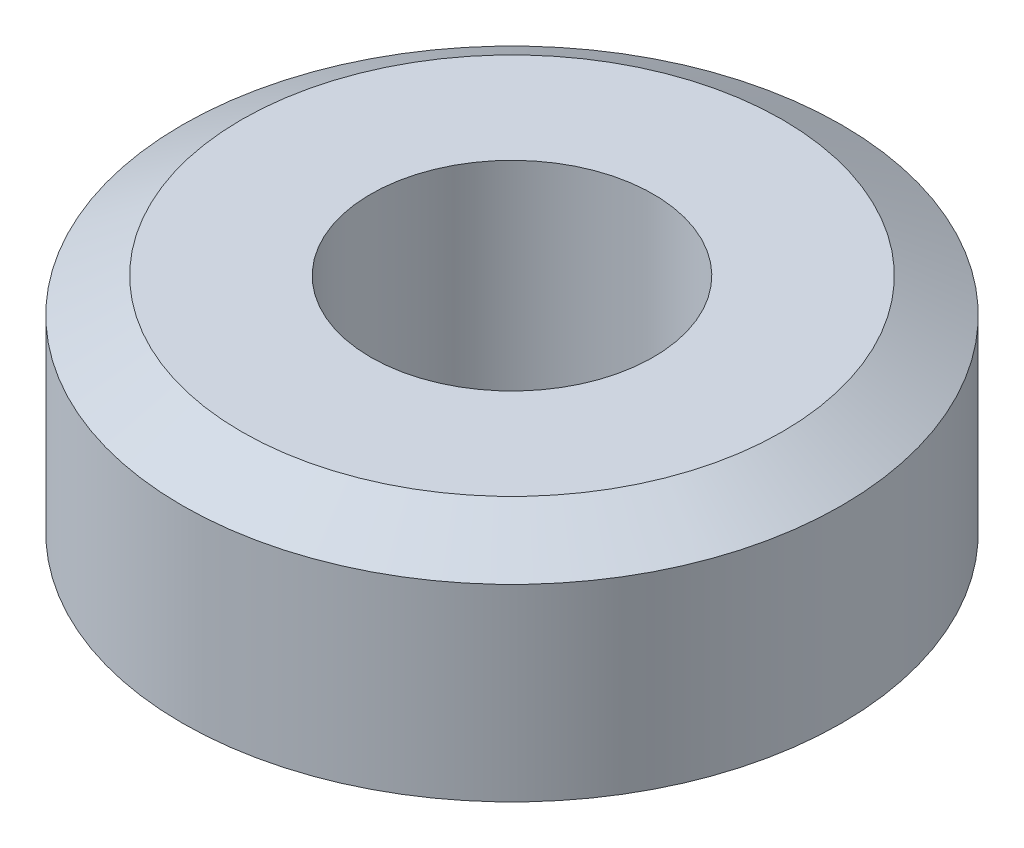
ISO-10303-21;
HEADER;
FILE_DESCRIPTION(('STEP AP214'),'2;1');
FILE_NAME('part.step','',(''),(''),'','','');
FILE_SCHEMA(('AUTOMOTIVE_DESIGN { 1 0 10303 214 1 1 1 1 }'));
ENDSEC;
DATA;
#1=APPLICATION_CONTEXT('core data for automotive mechanical design processes');
#2=APPLICATION_PROTOCOL_DEFINITION('international standard','automotive_design',2000,#1);
#3=PRODUCT_CONTEXT('',#1,'mechanical');
#4=PRODUCT('Part','Part','',(#3));
#5=PRODUCT_RELATED_PRODUCT_CATEGORY('part','',(#4));
#6=PRODUCT_DEFINITION_FORMATION('','',#4);
#7=PRODUCT_DEFINITION_CONTEXT('part definition',#1,'design');
#8=PRODUCT_DEFINITION('design','',#6,#7);
#9=PRODUCT_DEFINITION_SHAPE('','',#8);
#10=(LENGTH_UNIT() NAMED_UNIT(*) SI_UNIT(.MILLI.,.METRE.));
#11=(NAMED_UNIT(*) PLANE_ANGLE_UNIT() SI_UNIT($,.RADIAN.));
#12=(NAMED_UNIT(*) SI_UNIT($,.STERADIAN.) SOLID_ANGLE_UNIT());
#13=UNCERTAINTY_MEASURE_WITH_UNIT(LENGTH_MEASURE(1.E-05),#10,'distance_accuracy_value','');
#14=(GEOMETRIC_REPRESENTATION_CONTEXT(3) GLOBAL_UNCERTAINTY_ASSIGNED_CONTEXT((#13)) GLOBAL_UNIT_ASSIGNED_CONTEXT((#10,
#11,#12)) REPRESENTATION_CONTEXT('',''));
#15=CARTESIAN_POINT('',(0.,0.,0.));
#16=DIRECTION('',(0.,0.,1.));
#17=DIRECTION('',(1.,0.,0.));
#18=AXIS2_PLACEMENT_3D('',#15,#16,#17);
#19=CARTESIAN_POINT('',(0.,3.,0.));
#20=DIRECTION('',(0.,1.,0.));
#21=DIRECTION('',(0.,0.,1.));
#22=AXIS2_PLACEMENT_3D('',#19,#20,#21);
#23=PLANE('',#22);
#24=CARTESIAN_POINT('',(0.,3.,0.));
#25=DIRECTION('',(0.,1.,0.));
#26=DIRECTION('',(0.,0.,1.));
#27=AXIS2_PLACEMENT_3D('',#24,#25,#26);
#28=CIRCLE('',#27,3.15717967697245);
#29=CARTESIAN_POINT('',(0.,3.,-3.15717967697245));
#30=VERTEX_POINT('',#29);
#31=EDGE_CURVE('E57',#30,#30,#28,.T.);
#32=ORIENTED_EDGE('',*,*,#31,.T.);
#33=EDGE_LOOP('',(#32));
#34=FACE_BOUND('',#33,.T.);
#35=CARTESIAN_POINT('',(0.,3.,0.));
#36=DIRECTION('',(0.,1.,0.));
#37=DIRECTION('',(0.,0.,1.));
#38=AXIS2_PLACEMENT_3D('',#35,#36,#37);
#39=CIRCLE('',#38,1.65);
#40=CARTESIAN_POINT('',(0.,3.,1.65));
#41=VERTEX_POINT('',#40);
#42=EDGE_CURVE('E62',#41,#41,#39,.T.);
#43=ORIENTED_EDGE('',*,*,#42,.F.);
#44=EDGE_LOOP('',(#43));
#45=FACE_BOUND('',#44,.T.);
#46=ADVANCED_FACE('F41',(#34,#45),#23,.T.);
#47=CARTESIAN_POINT('',(0.,0.,0.));
#48=DIRECTION('',(0.,1.,0.));
#49=DIRECTION('',(0.,0.,1.));
#50=AXIS2_PLACEMENT_3D('',#47,#48,#49);
#51=PLANE('',#50);
#52=CARTESIAN_POINT('',(0.,0.,0.));
#53=DIRECTION('',(0.,1.,0.));
#54=DIRECTION('',(0.,0.,1.));
#55=AXIS2_PLACEMENT_3D('',#52,#53,#54);
#56=CIRCLE('',#55,3.15717967697245);
#57=CARTESIAN_POINT('',(0.,0.,3.15717967697245));
#58=VERTEX_POINT('',#57);
#59=EDGE_CURVE('E10',#58,#58,#56,.F.);
#60=ORIENTED_EDGE('',*,*,#59,.T.);
#61=EDGE_LOOP('',(#60));
#62=FACE_BOUND('',#61,.T.);
#63=CARTESIAN_POINT('',(0.,0.,0.));
#64=DIRECTION('',(0.,1.,0.));
#65=DIRECTION('',(0.,0.,1.));
#66=AXIS2_PLACEMENT_3D('',#63,#64,#65);
#67=CIRCLE('',#66,1.65);
#68=CARTESIAN_POINT('',(0.,0.,1.65));
#69=VERTEX_POINT('',#68);
#70=EDGE_CURVE('E63',#69,#69,#67,.T.);
#71=ORIENTED_EDGE('',*,*,#70,.T.);
#72=EDGE_LOOP('',(#71));
#73=FACE_BOUND('',#72,.T.);
#74=ADVANCED_FACE('F73',(#62,#73),#51,.F.);
#75=CARTESIAN_POINT('',(0.,3.,0.));
#76=DIRECTION('',(0.,-1.,0.));
#77=DIRECTION('',(0.,0.,-1.));
#78=AXIS2_PLACEMENT_3D('',#75,#76,#77);
#79=CYLINDRICAL_SURFACE('',#78,3.85);
#80=CARTESIAN_POINT('',(0.,0.400000000000002,0.));
#81=DIRECTION('',(0.,1.,0.));
#82=DIRECTION('',(0.,0.,1.));
#83=AXIS2_PLACEMENT_3D('',#80,#81,#82);
#84=CIRCLE('',#83,3.85);
#85=CARTESIAN_POINT('',(0.,0.400000000000002,3.85));
#86=VERTEX_POINT('',#85);
#87=EDGE_CURVE('E49',#86,#86,#84,.T.);
#88=ORIENTED_EDGE('',*,*,#87,.T.);
#89=EDGE_LOOP('',(#88));
#90=FACE_BOUND('',#89,.T.);
#91=CARTESIAN_POINT('',(0.,2.6,0.));
#92=DIRECTION('',(0.,1.,0.));
#93=DIRECTION('',(0.,0.,1.));
#94=AXIS2_PLACEMENT_3D('',#91,#92,#93);
#95=CIRCLE('',#94,3.85);
#96=CARTESIAN_POINT('',(0.,2.6,-3.85));
#97=VERTEX_POINT('',#96);
#98=EDGE_CURVE('E53',#97,#97,#95,.F.);
#99=ORIENTED_EDGE('',*,*,#98,.T.);
#100=EDGE_LOOP('',(#99));
#101=FACE_BOUND('',#100,.T.);
#102=ADVANCED_FACE('F81',(#90,#101),#79,.T.);
#103=CARTESIAN_POINT('',(0.,3.,0.));
#104=DIRECTION('',(0.,-1.,0.));
#105=DIRECTION('',(0.,0.,-1.));
#106=AXIS2_PLACEMENT_3D('',#103,#104,#105);
#107=CYLINDRICAL_SURFACE('',#106,1.65);
#108=ORIENTED_EDGE('',*,*,#42,.T.);
#109=EDGE_LOOP('',(#108));
#110=FACE_BOUND('',#109,.T.);
#111=ORIENTED_EDGE('',*,*,#70,.F.);
#112=EDGE_LOOP('',(#111));
#113=FACE_BOUND('',#112,.T.);
#114=ADVANCED_FACE('F69',(#110,#113),#107,.F.);
#115=CARTESIAN_POINT('',(0.,3.,0.));
#116=DIRECTION('',(0.,-1.,0.));
#117=DIRECTION('',(0.,0.,-1.));
#118=AXIS2_PLACEMENT_3D('',#115,#116,#117);
#119=CONICAL_SURFACE('',#118,3.15717967697245,1.0471975511966);
#120=CARTESIAN_POINT('',(0.,2.6,-3.85));
#121=CARTESIAN_POINT('',(0.,2.60416666666667,-3.84278312163513));
#122=CARTESIAN_POINT('',(0.,2.60833333333333,-3.83556624327026));
#123=CARTESIAN_POINT('',(0.,2.61666666666667,-3.82113248654052));
#124=CARTESIAN_POINT('',(0.,2.62083333333333,-3.81391560817565));
#125=CARTESIAN_POINT('',(0.,2.62916666666667,-3.79948185144591));
#126=CARTESIAN_POINT('',(0.,2.63333333333333,-3.79226497308104));
#127=CARTESIAN_POINT('',(0.,2.64166666666667,-3.7778312163513));
#128=CARTESIAN_POINT('',(0.,2.64583333333333,-3.77061433798643));
#129=CARTESIAN_POINT('',(0.,2.65416666666667,-3.75618058125669));
#130=CARTESIAN_POINT('',(0.,2.65833333333333,-3.74896370289182));
#131=CARTESIAN_POINT('',(0.,2.66666666666667,-3.73452994616208));
#132=CARTESIAN_POINT('',(0.,2.67083333333333,-3.72731306779721));
#133=CARTESIAN_POINT('',(0.,2.67916666666667,-3.71287931106746));
#134=CARTESIAN_POINT('',(0.,2.68333333333333,-3.70566243270259));
#135=CARTESIAN_POINT('',(0.,2.69166666666667,-3.69122867597285));
#136=CARTESIAN_POINT('',(0.,2.69583333333333,-3.68401179760798));
#137=CARTESIAN_POINT('',(0.,2.70416666666667,-3.66957804087824));
#138=CARTESIAN_POINT('',(0.,2.70833333333333,-3.66236116251337));
#139=CARTESIAN_POINT('',(0.,2.71666666666667,-3.64792740578363));
#140=CARTESIAN_POINT('',(0.,2.72083333333333,-3.64071052741876));
#141=CARTESIAN_POINT('',(0.,2.72916666666667,-3.62627677068902));
#142=CARTESIAN_POINT('',(0.,2.73333333333333,-3.61905989232415));
#143=CARTESIAN_POINT('',(0.,2.74166666666667,-3.60462613559441));
#144=CARTESIAN_POINT('',(0.,2.74583333333333,-3.59740925722954));
#145=CARTESIAN_POINT('',(0.,2.75416666666667,-3.5829755004998));
#146=CARTESIAN_POINT('',(0.,2.75833333333333,-3.57575862213493));
#147=CARTESIAN_POINT('',(0.,2.76666666666667,-3.56132486540519));
#148=CARTESIAN_POINT('',(0.,2.77083333333333,-3.55410798704032));
#149=CARTESIAN_POINT('',(0.,2.77916666666667,-3.53967423031058));
#150=CARTESIAN_POINT('',(0.,2.78333333333333,-3.53245735194571));
#151=CARTESIAN_POINT('',(0.,2.79166666666667,-3.51802359521597));
#152=CARTESIAN_POINT('',(0.,2.79583333333333,-3.5108067168511));
#153=CARTESIAN_POINT('',(0.,2.80416666666667,-3.49637296012136));
#154=CARTESIAN_POINT('',(0.,2.80833333333333,-3.48915608175649));
#155=CARTESIAN_POINT('',(0.,2.81666666666667,-3.47472232502674));
#156=CARTESIAN_POINT('',(0.,2.82083333333333,-3.46750544666188));
#157=CARTESIAN_POINT('',(0.,2.82916666666667,-3.45307168993213));
#158=CARTESIAN_POINT('',(0.,2.83333333333333,-3.44585481156726));
#159=CARTESIAN_POINT('',(0.,2.84166666666667,-3.43142105483752));
#160=CARTESIAN_POINT('',(0.,2.84583333333333,-3.42420417647265));
#161=CARTESIAN_POINT('',(0.,2.85416666666667,-3.40977041974291));
#162=CARTESIAN_POINT('',(0.,2.85833333333333,-3.40255354137804));
#163=CARTESIAN_POINT('',(0.,2.86666666666667,-3.3881197846483));
#164=CARTESIAN_POINT('',(0.,2.87083333333333,-3.38090290628343));
#165=CARTESIAN_POINT('',(0.,2.87916666666667,-3.36646914955369));
#166=CARTESIAN_POINT('',(0.,2.88333333333333,-3.35925227118882));
#167=CARTESIAN_POINT('',(0.,2.89166666666667,-3.34481851445908));
#168=CARTESIAN_POINT('',(0.,2.89583333333333,-3.33760163609421));
#169=CARTESIAN_POINT('',(0.,2.90416666666667,-3.32316787936447));
#170=CARTESIAN_POINT('',(0.,2.90833333333333,-3.3159510009996));
#171=CARTESIAN_POINT('',(0.,2.91666666666667,-3.30151724426986));
#172=CARTESIAN_POINT('',(0.,2.92083333333333,-3.29430036590499));
#173=CARTESIAN_POINT('',(0.,2.92916666666667,-3.27986660917525));
#174=CARTESIAN_POINT('',(0.,2.93333333333333,-3.27264973081038));
#175=CARTESIAN_POINT('',(0.,2.94166666666667,-3.25821597408064));
#176=CARTESIAN_POINT('',(0.,2.94583333333333,-3.25099909571577));
#177=CARTESIAN_POINT('',(0.,2.95416666666667,-3.23656533898603));
#178=CARTESIAN_POINT('',(0.,2.95833333333333,-3.22934846062116));
#179=CARTESIAN_POINT('',(0.,2.96666666666667,-3.21491470389141));
#180=CARTESIAN_POINT('',(0.,2.97083333333333,-3.20769782552654));
#181=CARTESIAN_POINT('',(0.,2.97916666666667,-3.1932640687968));
#182=CARTESIAN_POINT('',(0.,2.98333333333333,-3.18604719043193));
#183=CARTESIAN_POINT('',(0.,2.99166666666667,-3.17161343370219));
#184=CARTESIAN_POINT('',(0.,2.99583333333333,-3.16439655533732));
#185=CARTESIAN_POINT('',(0.,3.,-3.15717967697245));
#186=B_SPLINE_CURVE_WITH_KNOTS('',3,(#120,#121,#122,#123,#124,#125,#126,#127,#128,#129,#130,
#131,#132,#133,#134,#135,#136,#137,#138,#139,#140,#141,#142,#143,#144,#145,#146,#147,#148,#149,
#150,#151,#152,#153,#154,#155,#156,#157,#158,#159,#160,#161,#162,#163,#164,#165,#166,#167,#168,
#169,#170,#171,#172,#173,#174,#175,#176,#177,#178,#179,#180,#181,#182,#183,#184,#185),
.UNSPECIFIED.,.F.,.F.,(4,2,2,2,2,2,2,2,2,2,2,2,2,2,2,2,2,2,2,2,2,2,2,2,2,2,2,2,2,2,2,2,4),(0.,
0.0249999999999998,0.0499999999999999,0.0749999999999997,0.0999999999999999,0.125,0.15,
0.174999999999999,0.199999999999999,0.225,0.249999999999999,0.274999999999999,0.299999999999999,
0.324999999999999,0.349999999999999,0.374999999999999,0.399999999999999,0.424999999999999,
0.449999999999999,0.474999999999999,0.499999999999999,0.524999999999998,0.549999999999998,
0.574999999999998,0.599999999999998,0.624999999999998,0.649999999999998,0.674999999999998,
0.699999999999998,0.724999999999998,0.749999999999998,0.774999999999998,0.799999999999998),.UNSPECIFIED.);
#187=EDGE_CURVE('BSEAM87',#97,#30,#186,.T.);
#188=ORIENTED_EDGE('',*,*,#98,.F.);
#189=ORIENTED_EDGE('',*,*,#31,.F.);
#190=ORIENTED_EDGE('',*,*,#187,.T.);
#191=ORIENTED_EDGE('',*,*,#187,.F.);
#192=EDGE_LOOP('',(#188,#190,#189,#191));
#193=FACE_BOUND('',#192,.T.);
#194=ADVANCED_FACE('F87',(#193),#119,.T.);
#195=CARTESIAN_POINT('',(0.,0.400000000000002,0.));
#196=DIRECTION('',(0.,1.,0.));
#197=DIRECTION('',(0.,0.,1.));
#198=AXIS2_PLACEMENT_3D('',#195,#196,#197);
#199=CONICAL_SURFACE('',#198,3.85,1.0471975511966);
#200=ORIENTED_EDGE('',*,*,#59,.F.);
#201=EDGE_LOOP('',(#200));
#202=FACE_BOUND('',#201,.T.);
#203=ORIENTED_EDGE('',*,*,#87,.F.);
#204=EDGE_LOOP('',(#203));
#205=FACE_BOUND('',#204,.T.);
#206=ADVANCED_FACE('F44',(#202,#205),#199,.T.);
#207=CLOSED_SHELL('',(#46,#74,#102,#114,#194,#206));
#208=MANIFOLD_SOLID_BREP('B2',#207);
#209=ADVANCED_BREP_SHAPE_REPRESENTATION('',(#18,#208),#14);
#210=SHAPE_DEFINITION_REPRESENTATION(#9,#209);
ENDSEC;
END-ISO-10303-21;
